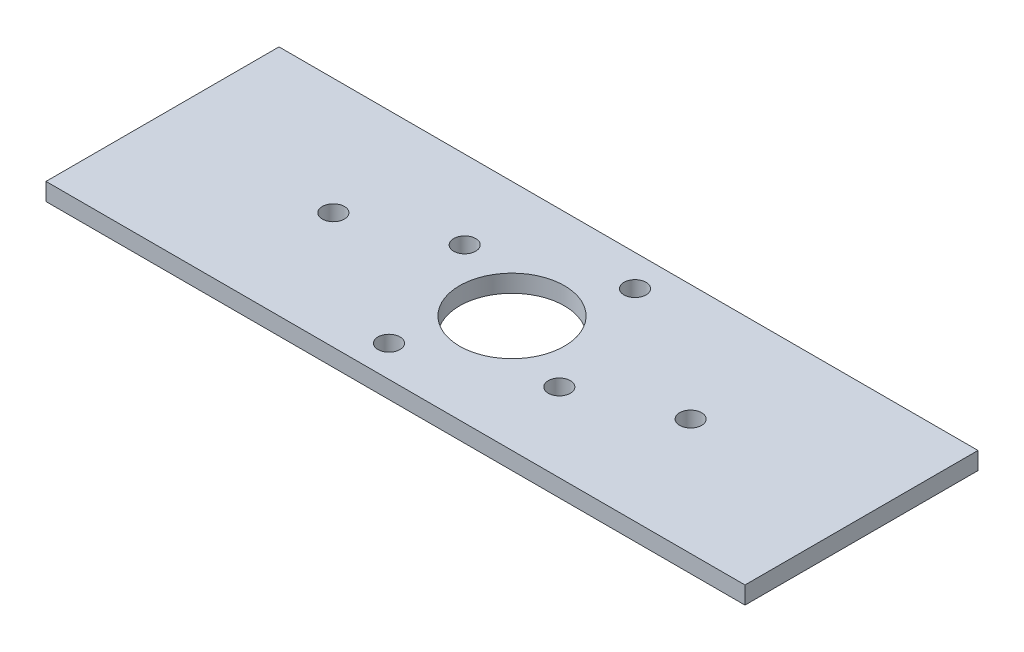
ISO-10303-21;
HEADER;
FILE_DESCRIPTION(('STEP AP214'),'2;1');
FILE_NAME('part.step','',(''),(''),'','','');
FILE_SCHEMA(('AUTOMOTIVE_DESIGN { 1 0 10303 214 1 1 1 1 }'));
ENDSEC;
DATA;
#1=APPLICATION_CONTEXT('core data for automotive mechanical design processes');
#2=APPLICATION_PROTOCOL_DEFINITION('international standard','automotive_design',2000,#1);
#3=PRODUCT_CONTEXT('',#1,'mechanical');
#4=PRODUCT('Part','Part','',(#3));
#5=PRODUCT_RELATED_PRODUCT_CATEGORY('part','',(#4));
#6=PRODUCT_DEFINITION_FORMATION('','',#4);
#7=PRODUCT_DEFINITION_CONTEXT('part definition',#1,'design');
#8=PRODUCT_DEFINITION('design','',#6,#7);
#9=PRODUCT_DEFINITION_SHAPE('','',#8);
#10=(LENGTH_UNIT() NAMED_UNIT(*) SI_UNIT(.MILLI.,.METRE.));
#11=(NAMED_UNIT(*) PLANE_ANGLE_UNIT() SI_UNIT($,.RADIAN.));
#12=(NAMED_UNIT(*) SI_UNIT($,.STERADIAN.) SOLID_ANGLE_UNIT());
#13=UNCERTAINTY_MEASURE_WITH_UNIT(LENGTH_MEASURE(1.E-05),#10,'distance_accuracy_value','');
#14=(GEOMETRIC_REPRESENTATION_CONTEXT(3) GLOBAL_UNCERTAINTY_ASSIGNED_CONTEXT((#13)) GLOBAL_UNIT_ASSIGNED_CONTEXT((#10,
#11,#12)) REPRESENTATION_CONTEXT('',''));
#15=CARTESIAN_POINT('',(0.,0.,0.));
#16=DIRECTION('',(0.,0.,1.));
#17=DIRECTION('',(1.,0.,0.));
#18=AXIS2_PLACEMENT_3D('',#15,#16,#17);
#19=CARTESIAN_POINT('',(95.25,4.7625,31.75));
#20=DIRECTION('',(-1.,0.,0.));
#21=DIRECTION('',(0.,0.,1.));
#22=AXIS2_PLACEMENT_3D('',#19,#20,#21);
#23=PLANE('',#22);
#24=DIRECTION('',(0.,0.,-1.));
#25=VECTOR('',#24,1.);
#26=CARTESIAN_POINT('',(95.25,0.,31.75));
#27=LINE('',#26,#25);
#28=CARTESIAN_POINT('',(95.25,0.,31.75));
#29=VERTEX_POINT('',#28);
#30=CARTESIAN_POINT('',(95.25,0.,-31.75));
#31=VERTEX_POINT('',#30);
#32=EDGE_CURVE('E95',#29,#31,#27,.T.);
#33=ORIENTED_EDGE('',*,*,#32,.T.);
#34=DIRECTION('',(0.,-1.,0.));
#35=VECTOR('',#34,1.);
#36=CARTESIAN_POINT('',(95.25,4.7625,-31.75));
#37=LINE('',#36,#35);
#38=CARTESIAN_POINT('',(95.25,4.7625,-31.75));
#39=VERTEX_POINT('',#38);
#40=EDGE_CURVE('E11',#39,#31,#37,.T.);
#41=ORIENTED_EDGE('',*,*,#40,.F.);
#42=DIRECTION('',(0.,0.,-1.));
#43=VECTOR('',#42,1.);
#44=CARTESIAN_POINT('',(95.25,4.7625,31.75));
#45=LINE('',#44,#43);
#46=CARTESIAN_POINT('',(95.25,4.7625,31.75));
#47=VERTEX_POINT('',#46);
#48=EDGE_CURVE('E83',#47,#39,#45,.T.);
#49=ORIENTED_EDGE('',*,*,#48,.F.);
#50=DIRECTION('',(0.,-1.,0.));
#51=VECTOR('',#50,1.);
#52=CARTESIAN_POINT('',(95.25,4.7625,31.75));
#53=LINE('',#52,#51);
#54=EDGE_CURVE('E91',#47,#29,#53,.T.);
#55=ORIENTED_EDGE('',*,*,#54,.T.);
#56=EDGE_LOOP('',(#33,#41,#49,#55));
#57=FACE_BOUND('',#56,.T.);
#58=ADVANCED_FACE('F32',(#57),#23,.F.);
#59=CARTESIAN_POINT('',(-95.25,4.7625,-31.75));
#60=DIRECTION('',(0.,0.,1.));
#61=DIRECTION('',(1.,0.,0.));
#62=AXIS2_PLACEMENT_3D('',#59,#60,#61);
#63=PLANE('',#62);
#64=DIRECTION('',(-1.,0.,0.));
#65=VECTOR('',#64,1.);
#66=CARTESIAN_POINT('',(-95.25,0.,-31.75));
#67=LINE('',#66,#65);
#68=CARTESIAN_POINT('',(-95.25,0.,-31.75));
#69=VERTEX_POINT('',#68);
#70=EDGE_CURVE('E87',#31,#69,#67,.T.);
#71=ORIENTED_EDGE('',*,*,#70,.T.);
#72=DIRECTION('',(0.,-1.,0.));
#73=VECTOR('',#72,1.);
#74=CARTESIAN_POINT('',(-95.25,4.7625,-31.75));
#75=LINE('',#74,#73);
#76=CARTESIAN_POINT('',(-95.25,4.7625,-31.75));
#77=VERTEX_POINT('',#76);
#78=EDGE_CURVE('E40',#77,#69,#75,.T.);
#79=ORIENTED_EDGE('',*,*,#78,.F.);
#80=DIRECTION('',(-1.,0.,0.));
#81=VECTOR('',#80,1.);
#82=CARTESIAN_POINT('',(-95.25,4.7625,-31.75));
#83=LINE('',#82,#81);
#84=EDGE_CURVE('E78',#39,#77,#83,.T.);
#85=ORIENTED_EDGE('',*,*,#84,.F.);
#86=ORIENTED_EDGE('',*,*,#40,.T.);
#87=EDGE_LOOP('',(#71,#79,#85,#86));
#88=FACE_BOUND('',#87,.T.);
#89=ADVANCED_FACE('F86',(#88),#63,.F.);
#90=CARTESIAN_POINT('',(-95.25,4.7625,31.75));
#91=DIRECTION('',(1.,0.,0.));
#92=DIRECTION('',(0.,0.,-1.));
#93=AXIS2_PLACEMENT_3D('',#90,#91,#92);
#94=PLANE('',#93);
#95=DIRECTION('',(0.,0.,1.));
#96=VECTOR('',#95,1.);
#97=CARTESIAN_POINT('',(-95.25,0.,31.75));
#98=LINE('',#97,#96);
#99=CARTESIAN_POINT('',(-95.25,0.,31.75));
#100=VERTEX_POINT('',#99);
#101=EDGE_CURVE('E65',#69,#100,#98,.T.);
#102=ORIENTED_EDGE('',*,*,#101,.T.);
#103=DIRECTION('',(0.,-1.,0.));
#104=VECTOR('',#103,1.);
#105=CARTESIAN_POINT('',(-95.25,4.7625,31.75));
#106=LINE('',#105,#104);
#107=CARTESIAN_POINT('',(-95.25,4.7625,31.75));
#108=VERTEX_POINT('',#107);
#109=EDGE_CURVE('E88',#108,#100,#106,.T.);
#110=ORIENTED_EDGE('',*,*,#109,.F.);
#111=DIRECTION('',(0.,0.,1.));
#112=VECTOR('',#111,1.);
#113=CARTESIAN_POINT('',(-95.25,4.7625,31.75));
#114=LINE('',#113,#112);
#115=EDGE_CURVE('E81',#77,#108,#114,.T.);
#116=ORIENTED_EDGE('',*,*,#115,.F.);
#117=ORIENTED_EDGE('',*,*,#78,.T.);
#118=EDGE_LOOP('',(#102,#110,#116,#117));
#119=FACE_BOUND('',#118,.T.);
#120=ADVANCED_FACE('F89',(#119),#94,.F.);
#121=CARTESIAN_POINT('',(-95.25,4.7625,31.75));
#122=DIRECTION('',(0.,0.,-1.));
#123=DIRECTION('',(-1.,0.,0.));
#124=AXIS2_PLACEMENT_3D('',#121,#122,#123);
#125=PLANE('',#124);
#126=DIRECTION('',(1.,0.,0.));
#127=VECTOR('',#126,1.);
#128=CARTESIAN_POINT('',(-95.25,0.,31.75));
#129=LINE('',#128,#127);
#130=EDGE_CURVE('E71',#100,#29,#129,.T.);
#131=ORIENTED_EDGE('',*,*,#130,.T.);
#132=ORIENTED_EDGE('',*,*,#54,.F.);
#133=DIRECTION('',(1.,0.,0.));
#134=VECTOR('',#133,1.);
#135=CARTESIAN_POINT('',(-95.25,4.7625,31.75));
#136=LINE('',#135,#134);
#137=EDGE_CURVE('E48',#108,#47,#136,.T.);
#138=ORIENTED_EDGE('',*,*,#137,.F.);
#139=ORIENTED_EDGE('',*,*,#109,.T.);
#140=EDGE_LOOP('',(#131,#132,#138,#139));
#141=FACE_BOUND('',#140,.T.);
#142=ADVANCED_FACE('F103',(#141),#125,.F.);
#143=CARTESIAN_POINT('',(0.,4.7625,0.));
#144=DIRECTION('',(0.,-1.,0.));
#145=DIRECTION('',(0.,0.,-1.));
#146=AXIS2_PLACEMENT_3D('',#143,#144,#145);
#147=PLANE('',#146);
#148=CARTESIAN_POINT('',(-23.2097973905483,4.7625,-10.3182026094516));
#149=DIRECTION('',(0.,1.,0.));
#150=DIRECTION('',(0.,0.,1.));
#151=AXIS2_PLACEMENT_3D('',#148,#149,#150);
#152=CIRCLE('',#151,3.);
#153=CARTESIAN_POINT('',(-23.2097973905483,4.7625,-7.31820260945165));
#154=VERTEX_POINT('',#153);
#155=EDGE_CURVE('E147',#154,#154,#152,.T.);
#156=ORIENTED_EDGE('',*,*,#155,.F.);
#157=EDGE_LOOP('',(#156));
#158=FACE_BOUND('',#157,.T.);
#159=CARTESIAN_POINT('',(-10.3182026094516,4.7625,23.2097973905484));
#160=DIRECTION('',(0.,1.,0.));
#161=DIRECTION('',(0.,0.,1.));
#162=AXIS2_PLACEMENT_3D('',#159,#160,#161);
#163=CIRCLE('',#162,3.);
#164=CARTESIAN_POINT('',(-10.3182026094516,4.7625,26.2097973905483));
#165=VERTEX_POINT('',#164);
#166=EDGE_CURVE('E141',#165,#165,#163,.T.);
#167=ORIENTED_EDGE('',*,*,#166,.F.);
#168=EDGE_LOOP('',(#167));
#169=FACE_BOUND('',#168,.T.);
#170=CARTESIAN_POINT('',(10.3182026094517,4.7625,-23.2097973905484));
#171=DIRECTION('',(0.,1.,0.));
#172=DIRECTION('',(0.,0.,1.));
#173=AXIS2_PLACEMENT_3D('',#170,#171,#172);
#174=CIRCLE('',#173,3.);
#175=CARTESIAN_POINT('',(10.3182026094517,4.7625,-20.2097973905484));
#176=VERTEX_POINT('',#175);
#177=EDGE_CURVE('E135',#176,#176,#174,.T.);
#178=ORIENTED_EDGE('',*,*,#177,.F.);
#179=EDGE_LOOP('',(#178));
#180=FACE_BOUND('',#179,.T.);
#181=CARTESIAN_POINT('',(23.2097973905484,4.7625,10.3182026094516));
#182=DIRECTION('',(0.,1.,0.));
#183=DIRECTION('',(0.,0.,1.));
#184=AXIS2_PLACEMENT_3D('',#181,#182,#183);
#185=CIRCLE('',#184,3.);
#186=CARTESIAN_POINT('',(23.2097973905484,4.7625,13.3182026094516));
#187=VERTEX_POINT('',#186);
#188=EDGE_CURVE('E129',#187,#187,#185,.T.);
#189=ORIENTED_EDGE('',*,*,#188,.F.);
#190=EDGE_LOOP('',(#189));
#191=FACE_BOUND('',#190,.T.);
#192=CARTESIAN_POINT('',(-48.6833333333333,4.7625,0.));
#193=DIRECTION('',(0.,1.,0.));
#194=DIRECTION('',(0.,0.,1.));
#195=AXIS2_PLACEMENT_3D('',#192,#193,#194);
#196=CIRCLE('',#195,3.);
#197=CARTESIAN_POINT('',(-48.6833333333333,4.7625,3.));
#198=VERTEX_POINT('',#197);
#199=EDGE_CURVE('E123',#198,#198,#196,.T.);
#200=ORIENTED_EDGE('',*,*,#199,.F.);
#201=EDGE_LOOP('',(#200));
#202=FACE_BOUND('',#201,.T.);
#203=CARTESIAN_POINT('',(48.6833333333333,4.7625,0.));
#204=DIRECTION('',(0.,1.,0.));
#205=DIRECTION('',(0.,0.,1.));
#206=AXIS2_PLACEMENT_3D('',#203,#204,#205);
#207=CIRCLE('',#206,3.);
#208=CARTESIAN_POINT('',(48.6833333333333,4.7625,3.));
#209=VERTEX_POINT('',#208);
#210=EDGE_CURVE('E117',#209,#209,#207,.T.);
#211=ORIENTED_EDGE('',*,*,#210,.F.);
#212=EDGE_LOOP('',(#211));
#213=FACE_BOUND('',#212,.T.);
#214=CARTESIAN_POINT('',(0.,4.7625,0.));
#215=DIRECTION('',(0.,1.,0.));
#216=DIRECTION('',(0.,0.,1.));
#217=AXIS2_PLACEMENT_3D('',#214,#215,#216);
#218=CIRCLE('',#217,14.2875);
#219=CARTESIAN_POINT('',(0.,4.7625,14.2875));
#220=VERTEX_POINT('',#219);
#221=EDGE_CURVE('E109',#220,#220,#218,.T.);
#222=ORIENTED_EDGE('',*,*,#221,.F.);
#223=EDGE_LOOP('',(#222));
#224=FACE_BOUND('',#223,.T.);
#225=ORIENTED_EDGE('',*,*,#48,.T.);
#226=ORIENTED_EDGE('',*,*,#84,.T.);
#227=ORIENTED_EDGE('',*,*,#115,.T.);
#228=ORIENTED_EDGE('',*,*,#137,.T.);
#229=EDGE_LOOP('',(#225,#226,#227,#228));
#230=FACE_BOUND('',#229,.T.);
#231=ADVANCED_FACE('F79',(#158,#169,#180,#191,#202,#213,#224,#230),#147,.F.);
#232=CARTESIAN_POINT('',(0.,0.,0.));
#233=DIRECTION('',(0.,-1.,0.));
#234=DIRECTION('',(0.,0.,-1.));
#235=AXIS2_PLACEMENT_3D('',#232,#233,#234);
#236=PLANE('',#235);
#237=CARTESIAN_POINT('',(-23.2097973905483,0.,-10.3182026094516));
#238=DIRECTION('',(0.,1.,0.));
#239=DIRECTION('',(0.,0.,1.));
#240=AXIS2_PLACEMENT_3D('',#237,#238,#239);
#241=CIRCLE('',#240,3.);
#242=CARTESIAN_POINT('',(-23.2097973905483,0.,-7.31820260945165));
#243=VERTEX_POINT('',#242);
#244=EDGE_CURVE('E144',#243,#243,#241,.T.);
#245=ORIENTED_EDGE('',*,*,#244,.T.);
#246=EDGE_LOOP('',(#245));
#247=FACE_BOUND('',#246,.T.);
#248=CARTESIAN_POINT('',(-10.3182026094516,0.,23.2097973905484));
#249=DIRECTION('',(0.,1.,0.));
#250=DIRECTION('',(0.,0.,1.));
#251=AXIS2_PLACEMENT_3D('',#248,#249,#250);
#252=CIRCLE('',#251,3.);
#253=CARTESIAN_POINT('',(-10.3182026094516,0.,26.2097973905483));
#254=VERTEX_POINT('',#253);
#255=EDGE_CURVE('E138',#254,#254,#252,.T.);
#256=ORIENTED_EDGE('',*,*,#255,.T.);
#257=EDGE_LOOP('',(#256));
#258=FACE_BOUND('',#257,.T.);
#259=CARTESIAN_POINT('',(10.3182026094517,0.,-23.2097973905484));
#260=DIRECTION('',(0.,1.,0.));
#261=DIRECTION('',(0.,0.,1.));
#262=AXIS2_PLACEMENT_3D('',#259,#260,#261);
#263=CIRCLE('',#262,3.);
#264=CARTESIAN_POINT('',(10.3182026094517,0.,-20.2097973905484));
#265=VERTEX_POINT('',#264);
#266=EDGE_CURVE('E132',#265,#265,#263,.T.);
#267=ORIENTED_EDGE('',*,*,#266,.T.);
#268=EDGE_LOOP('',(#267));
#269=FACE_BOUND('',#268,.T.);
#270=CARTESIAN_POINT('',(23.2097973905484,0.,10.3182026094516));
#271=DIRECTION('',(0.,1.,0.));
#272=DIRECTION('',(0.,0.,1.));
#273=AXIS2_PLACEMENT_3D('',#270,#271,#272);
#274=CIRCLE('',#273,3.);
#275=CARTESIAN_POINT('',(23.2097973905484,0.,13.3182026094516));
#276=VERTEX_POINT('',#275);
#277=EDGE_CURVE('E126',#276,#276,#274,.T.);
#278=ORIENTED_EDGE('',*,*,#277,.T.);
#279=EDGE_LOOP('',(#278));
#280=FACE_BOUND('',#279,.T.);
#281=CARTESIAN_POINT('',(-48.6833333333333,0.,0.));
#282=DIRECTION('',(0.,1.,0.));
#283=DIRECTION('',(0.,0.,1.));
#284=AXIS2_PLACEMENT_3D('',#281,#282,#283);
#285=CIRCLE('',#284,3.);
#286=CARTESIAN_POINT('',(-48.6833333333333,0.,3.));
#287=VERTEX_POINT('',#286);
#288=EDGE_CURVE('E120',#287,#287,#285,.T.);
#289=ORIENTED_EDGE('',*,*,#288,.T.);
#290=EDGE_LOOP('',(#289));
#291=FACE_BOUND('',#290,.T.);
#292=CARTESIAN_POINT('',(48.6833333333333,0.,0.));
#293=DIRECTION('',(0.,1.,0.));
#294=DIRECTION('',(0.,0.,1.));
#295=AXIS2_PLACEMENT_3D('',#292,#293,#294);
#296=CIRCLE('',#295,3.);
#297=CARTESIAN_POINT('',(48.6833333333333,0.,3.));
#298=VERTEX_POINT('',#297);
#299=EDGE_CURVE('E112',#298,#298,#296,.T.);
#300=ORIENTED_EDGE('',*,*,#299,.T.);
#301=EDGE_LOOP('',(#300));
#302=FACE_BOUND('',#301,.T.);
#303=CARTESIAN_POINT('',(0.,0.,0.));
#304=DIRECTION('',(0.,1.,0.));
#305=DIRECTION('',(0.,0.,1.));
#306=AXIS2_PLACEMENT_3D('',#303,#304,#305);
#307=CIRCLE('',#306,14.2875);
#308=CARTESIAN_POINT('',(0.,0.,14.2875));
#309=VERTEX_POINT('',#308);
#310=EDGE_CURVE('E98',#309,#309,#307,.T.);
#311=ORIENTED_EDGE('',*,*,#310,.T.);
#312=EDGE_LOOP('',(#311));
#313=FACE_BOUND('',#312,.T.);
#314=ORIENTED_EDGE('',*,*,#32,.F.);
#315=ORIENTED_EDGE('',*,*,#130,.F.);
#316=ORIENTED_EDGE('',*,*,#101,.F.);
#317=ORIENTED_EDGE('',*,*,#70,.F.);
#318=EDGE_LOOP('',(#314,#315,#316,#317));
#319=FACE_BOUND('',#318,.T.);
#320=ADVANCED_FACE('F106',(#247,#258,#269,#280,#291,#302,#313,#319),#236,.T.);
#321=CARTESIAN_POINT('',(0.,0.,0.));
#322=DIRECTION('',(0.,1.,0.));
#323=DIRECTION('',(0.,0.,1.));
#324=AXIS2_PLACEMENT_3D('',#321,#322,#323);
#325=CYLINDRICAL_SURFACE('',#324,14.2875);
#326=CARTESIAN_POINT('',(0.,0.,14.2875));
#327=CARTESIAN_POINT('',(0.,0.049609375,14.2875));
#328=CARTESIAN_POINT('',(0.,0.09921875,14.2875));
#329=CARTESIAN_POINT('',(0.,0.1984375,14.2875));
#330=CARTESIAN_POINT('',(0.,0.248046875,14.2875));
#331=CARTESIAN_POINT('',(0.,0.347265625,14.2875));
#332=CARTESIAN_POINT('',(0.,0.396875,14.2875));
#333=CARTESIAN_POINT('',(0.,0.49609375,14.2875));
#334=CARTESIAN_POINT('',(0.,0.545703125,14.2875));
#335=CARTESIAN_POINT('',(0.,0.644921875,14.2875));
#336=CARTESIAN_POINT('',(0.,0.69453125,14.2875));
#337=CARTESIAN_POINT('',(0.,0.79375,14.2875));
#338=CARTESIAN_POINT('',(0.,0.843359375,14.2875));
#339=CARTESIAN_POINT('',(0.,0.942578125,14.2875));
#340=CARTESIAN_POINT('',(0.,0.9921875,14.2875));
#341=CARTESIAN_POINT('',(0.,1.09140625,14.2875));
#342=CARTESIAN_POINT('',(0.,1.141015625,14.2875));
#343=CARTESIAN_POINT('',(0.,1.240234375,14.2875));
#344=CARTESIAN_POINT('',(0.,1.28984375,14.2875));
#345=CARTESIAN_POINT('',(0.,1.3890625,14.2875));
#346=CARTESIAN_POINT('',(0.,1.438671875,14.2875));
#347=CARTESIAN_POINT('',(0.,1.537890625,14.2875));
#348=CARTESIAN_POINT('',(0.,1.5875,14.2875));
#349=CARTESIAN_POINT('',(0.,1.68671875,14.2875));
#350=CARTESIAN_POINT('',(0.,1.736328125,14.2875));
#351=CARTESIAN_POINT('',(0.,1.835546875,14.2875));
#352=CARTESIAN_POINT('',(0.,1.88515625,14.2875));
#353=CARTESIAN_POINT('',(0.,1.984375,14.2875));
#354=CARTESIAN_POINT('',(0.,2.033984375,14.2875));
#355=CARTESIAN_POINT('',(0.,2.133203125,14.2875));
#356=CARTESIAN_POINT('',(0.,2.1828125,14.2875));
#357=CARTESIAN_POINT('',(0.,2.28203125,14.2875));
#358=CARTESIAN_POINT('',(0.,2.331640625,14.2875));
#359=CARTESIAN_POINT('',(0.,2.430859375,14.2875));
#360=CARTESIAN_POINT('',(0.,2.48046875,14.2875));
#361=CARTESIAN_POINT('',(0.,2.5796875,14.2875));
#362=CARTESIAN_POINT('',(0.,2.629296875,14.2875));
#363=CARTESIAN_POINT('',(0.,2.728515625,14.2875));
#364=CARTESIAN_POINT('',(0.,2.778125,14.2875));
#365=CARTESIAN_POINT('',(0.,2.87734375,14.2875));
#366=CARTESIAN_POINT('',(0.,2.926953125,14.2875));
#367=CARTESIAN_POINT('',(0.,3.026171875,14.2875));
#368=CARTESIAN_POINT('',(0.,3.07578125,14.2875));
#369=CARTESIAN_POINT('',(0.,3.175,14.2875));
#370=CARTESIAN_POINT('',(0.,3.224609375,14.2875));
#371=CARTESIAN_POINT('',(0.,3.323828125,14.2875));
#372=CARTESIAN_POINT('',(0.,3.3734375,14.2875));
#373=CARTESIAN_POINT('',(0.,3.47265625,14.2875));
#374=CARTESIAN_POINT('',(0.,3.522265625,14.2875));
#375=CARTESIAN_POINT('',(0.,3.621484375,14.2875));
#376=CARTESIAN_POINT('',(0.,3.67109375,14.2875));
#377=CARTESIAN_POINT('',(0.,3.7703125,14.2875));
#378=CARTESIAN_POINT('',(0.,3.819921875,14.2875));
#379=CARTESIAN_POINT('',(0.,3.919140625,14.2875));
#380=CARTESIAN_POINT('',(0.,3.96875,14.2875));
#381=CARTESIAN_POINT('',(0.,4.06796875,14.2875));
#382=CARTESIAN_POINT('',(0.,4.117578125,14.2875));
#383=CARTESIAN_POINT('',(0.,4.216796875,14.2875));
#384=CARTESIAN_POINT('',(0.,4.26640625,14.2875));
#385=CARTESIAN_POINT('',(0.,4.365625,14.2875));
#386=CARTESIAN_POINT('',(0.,4.415234375,14.2875));
#387=CARTESIAN_POINT('',(0.,4.514453125,14.2875));
#388=CARTESIAN_POINT('',(0.,4.5640625,14.2875));
#389=CARTESIAN_POINT('',(0.,4.66328125,14.2875));
#390=CARTESIAN_POINT('',(0.,4.712890625,14.2875));
#391=CARTESIAN_POINT('',(0.,4.7625,14.2875));
#392=B_SPLINE_CURVE_WITH_KNOTS('',3,(#326,#327,#328,#329,#330,#331,#332,#333,#334,#335,#336,
#337,#338,#339,#340,#341,#342,#343,#344,#345,#346,#347,#348,#349,#350,#351,#352,#353,#354,#355,
#356,#357,#358,#359,#360,#361,#362,#363,#364,#365,#366,#367,#368,#369,#370,#371,#372,#373,#374,
#375,#376,#377,#378,#379,#380,#381,#382,#383,#384,#385,#386,#387,#388,#389,#390,#391),
.UNSPECIFIED.,.F.,.F.,(4,2,2,2,2,2,2,2,2,2,2,2,2,2,2,2,2,2,2,2,2,2,2,2,2,2,2,2,2,2,2,2,4),(0.,
0.148828125,0.29765625,0.446484375,0.5953125,0.744140625,0.89296875,1.041796875,1.190625,
1.339453125,1.48828125,1.637109375,1.7859375,1.934765625,2.08359375,2.232421875,2.38125,
2.530078125,2.67890625,2.827734375,2.9765625,3.125390625,3.27421875,3.423046875,3.571875,
3.720703125,3.86953125,4.018359375,4.1671875,4.316015625,4.46484375,4.613671875,4.7625),.UNSPECIFIED.);
#393=EDGE_CURVE('BSEAM168',#309,#220,#392,.T.);
#394=ORIENTED_EDGE('',*,*,#310,.F.);
#395=ORIENTED_EDGE('',*,*,#221,.T.);
#396=ORIENTED_EDGE('',*,*,#393,.T.);
#397=ORIENTED_EDGE('',*,*,#393,.F.);
#398=EDGE_LOOP('',(#394,#396,#395,#397));
#399=FACE_BOUND('',#398,.T.);
#400=ADVANCED_FACE('F168',(#399),#325,.F.);
#401=CARTESIAN_POINT('',(48.6833333333333,4.7625,0.));
#402=DIRECTION('',(0.,1.,0.));
#403=DIRECTION('',(0.,0.,1.));
#404=AXIS2_PLACEMENT_3D('',#401,#402,#403);
#405=CYLINDRICAL_SURFACE('',#404,3.);
#406=ORIENTED_EDGE('',*,*,#299,.F.);
#407=EDGE_LOOP('',(#406));
#408=FACE_BOUND('',#407,.T.);
#409=ORIENTED_EDGE('',*,*,#210,.T.);
#410=EDGE_LOOP('',(#409));
#411=FACE_BOUND('',#410,.T.);
#412=ADVANCED_FACE('F170',(#408,#411),#405,.F.);
#413=CARTESIAN_POINT('',(-48.6833333333333,4.7625,0.));
#414=DIRECTION('',(0.,1.,0.));
#415=DIRECTION('',(0.,0.,1.));
#416=AXIS2_PLACEMENT_3D('',#413,#414,#415);
#417=CYLINDRICAL_SURFACE('',#416,3.);
#418=ORIENTED_EDGE('',*,*,#288,.F.);
#419=EDGE_LOOP('',(#418));
#420=FACE_BOUND('',#419,.T.);
#421=ORIENTED_EDGE('',*,*,#199,.T.);
#422=EDGE_LOOP('',(#421));
#423=FACE_BOUND('',#422,.T.);
#424=ADVANCED_FACE('F177',(#420,#423),#417,.F.);
#425=CARTESIAN_POINT('',(23.2097973905484,4.7625,10.3182026094516));
#426=DIRECTION('',(0.,1.,0.));
#427=DIRECTION('',(0.,0.,1.));
#428=AXIS2_PLACEMENT_3D('',#425,#426,#427);
#429=CYLINDRICAL_SURFACE('',#428,3.);
#430=ORIENTED_EDGE('',*,*,#277,.F.);
#431=EDGE_LOOP('',(#430));
#432=FACE_BOUND('',#431,.T.);
#433=ORIENTED_EDGE('',*,*,#188,.T.);
#434=EDGE_LOOP('',(#433));
#435=FACE_BOUND('',#434,.T.);
#436=ADVANCED_FACE('F223',(#432,#435),#429,.F.);
#437=CARTESIAN_POINT('',(10.3182026094517,4.7625,-23.2097973905484));
#438=DIRECTION('',(0.,1.,0.));
#439=DIRECTION('',(0.,0.,1.));
#440=AXIS2_PLACEMENT_3D('',#437,#438,#439);
#441=CYLINDRICAL_SURFACE('',#440,3.);
#442=ORIENTED_EDGE('',*,*,#266,.F.);
#443=EDGE_LOOP('',(#442));
#444=FACE_BOUND('',#443,.T.);
#445=ORIENTED_EDGE('',*,*,#177,.T.);
#446=EDGE_LOOP('',(#445));
#447=FACE_BOUND('',#446,.T.);
#448=ADVANCED_FACE('F233',(#444,#447),#441,.F.);
#449=CARTESIAN_POINT('',(-10.3182026094516,4.7625,23.2097973905484));
#450=DIRECTION('',(0.,1.,0.));
#451=DIRECTION('',(0.,0.,1.));
#452=AXIS2_PLACEMENT_3D('',#449,#450,#451);
#453=CYLINDRICAL_SURFACE('',#452,3.);
#454=ORIENTED_EDGE('',*,*,#255,.F.);
#455=EDGE_LOOP('',(#454));
#456=FACE_BOUND('',#455,.T.);
#457=ORIENTED_EDGE('',*,*,#166,.T.);
#458=EDGE_LOOP('',(#457));
#459=FACE_BOUND('',#458,.T.);
#460=ADVANCED_FACE('F243',(#456,#459),#453,.F.);
#461=CARTESIAN_POINT('',(-23.2097973905483,4.7625,-10.3182026094516));
#462=DIRECTION('',(0.,1.,0.));
#463=DIRECTION('',(0.,0.,1.));
#464=AXIS2_PLACEMENT_3D('',#461,#462,#463);
#465=CYLINDRICAL_SURFACE('',#464,3.);
#466=ORIENTED_EDGE('',*,*,#244,.F.);
#467=EDGE_LOOP('',(#466));
#468=FACE_BOUND('',#467,.T.);
#469=ORIENTED_EDGE('',*,*,#155,.T.);
#470=EDGE_LOOP('',(#469));
#471=FACE_BOUND('',#470,.T.);
#472=ADVANCED_FACE('F151',(#468,#471),#465,.F.);
#473=CLOSED_SHELL('',(#58,#89,#120,#142,#231,#320,#400,#412,#424,#436,#448,#460,#472));
#474=MANIFOLD_SOLID_BREP('B2',#473);
#475=ADVANCED_BREP_SHAPE_REPRESENTATION('',(#18,#474),#14);
#476=SHAPE_DEFINITION_REPRESENTATION(#9,#475);
ENDSEC;
END-ISO-10303-21;
